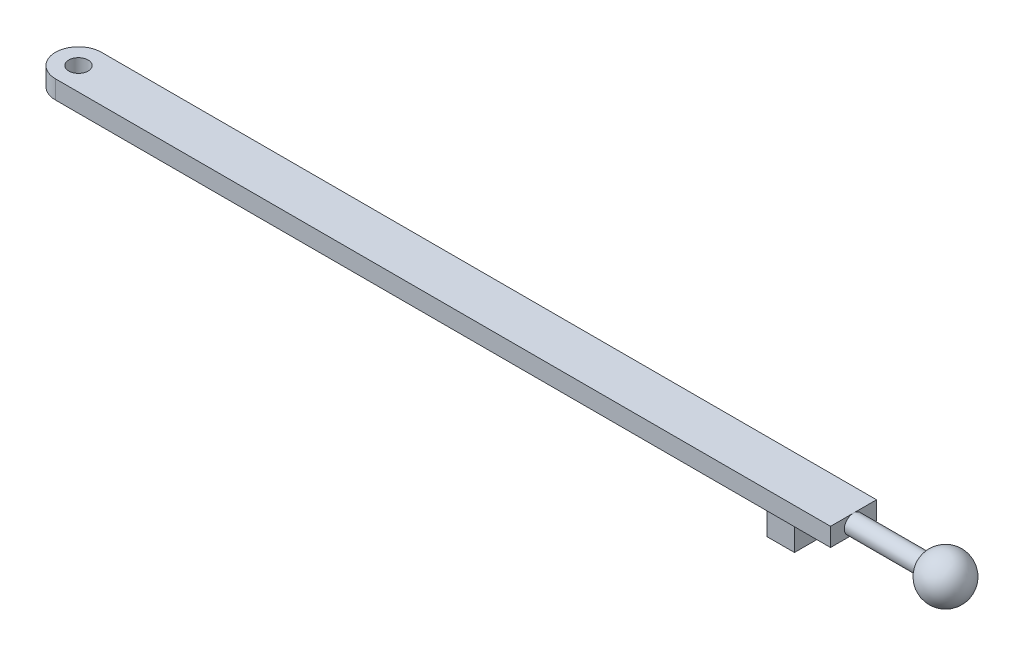
ISO-10303-21;
HEADER;
FILE_DESCRIPTION(('STEP AP214'),'2;1');
FILE_NAME('part.step','',(''),(''),'','','');
FILE_SCHEMA(('AUTOMOTIVE_DESIGN { 1 0 10303 214 1 1 1 1 }'));
ENDSEC;
DATA;
#1=APPLICATION_CONTEXT('core data for automotive mechanical design processes');
#2=APPLICATION_PROTOCOL_DEFINITION('international standard','automotive_design',2000,#1);
#3=PRODUCT_CONTEXT('',#1,'mechanical');
#4=PRODUCT('Part','Part','',(#3));
#5=PRODUCT_RELATED_PRODUCT_CATEGORY('part','',(#4));
#6=PRODUCT_DEFINITION_FORMATION('','',#4);
#7=PRODUCT_DEFINITION_CONTEXT('part definition',#1,'design');
#8=PRODUCT_DEFINITION('design','',#6,#7);
#9=PRODUCT_DEFINITION_SHAPE('','',#8);
#10=(LENGTH_UNIT() NAMED_UNIT(*) SI_UNIT(.MILLI.,.METRE.));
#11=(NAMED_UNIT(*) PLANE_ANGLE_UNIT() SI_UNIT($,.RADIAN.));
#12=(NAMED_UNIT(*) SI_UNIT($,.STERADIAN.) SOLID_ANGLE_UNIT());
#13=UNCERTAINTY_MEASURE_WITH_UNIT(LENGTH_MEASURE(1.E-05),#10,'distance_accuracy_value','');
#14=(GEOMETRIC_REPRESENTATION_CONTEXT(3) GLOBAL_UNCERTAINTY_ASSIGNED_CONTEXT((#13)) GLOBAL_UNIT_ASSIGNED_CONTEXT((#10,
#11,#12)) REPRESENTATION_CONTEXT('',''));
#15=CARTESIAN_POINT('',(0.,0.,0.));
#16=DIRECTION('',(0.,0.,1.));
#17=DIRECTION('',(1.,0.,0.));
#18=AXIS2_PLACEMENT_3D('',#15,#16,#17);
#19=CARTESIAN_POINT('',(11.,1.,0.));
#20=DIRECTION('',(-1.,0.,0.));
#21=DIRECTION('',(0.,0.,1.));
#22=AXIS2_PLACEMENT_3D('',#19,#20,#21);
#23=CYLINDRICAL_SURFACE('',#22,1.);
#24=CARTESIAN_POINT('',(0.,1.,0.));
#25=DIRECTION('',(1.,0.,0.));
#26=DIRECTION('',(0.,0.,-1.));
#27=AXIS2_PLACEMENT_3D('',#24,#25,#26);
#28=CIRCLE('',#27,1.);
#29=CARTESIAN_POINT('',(0.,2.,0.));
#30=VERTEX_POINT('',#29);
#31=CARTESIAN_POINT('',(0.,0.,0.));
#32=VERTEX_POINT('',#31);
#33=EDGE_CURVE('E166',#30,#32,#28,.T.);
#34=ORIENTED_EDGE('',*,*,#33,.T.);
#35=EDGE_CURVE('E49',#32,#30,#28,.T.);
#36=ORIENTED_EDGE('',*,*,#35,.T.);
#37=EDGE_LOOP('',(#34,#36));
#38=FACE_BOUND('',#37,.T.);
#39=CARTESIAN_POINT('',(7.70871215252208,1.,0.));
#40=DIRECTION('',(1.,0.,0.));
#41=DIRECTION('',(0.,0.,-1.));
#42=AXIS2_PLACEMENT_3D('',#39,#40,#41);
#43=CIRCLE('',#42,1.);
#44=CARTESIAN_POINT('',(7.70871215252208,1.,-1.));
#45=VERTEX_POINT('',#44);
#46=EDGE_CURVE('E11',#45,#45,#43,.T.);
#47=ORIENTED_EDGE('',*,*,#46,.F.);
#48=EDGE_LOOP('',(#47));
#49=FACE_BOUND('',#48,.T.);
#50=ADVANCED_FACE('F41',(#38,#49),#23,.T.);
#51=CARTESIAN_POINT('',(-10.,0.,0.));
#52=DIRECTION('',(0.,1.,0.));
#53=DIRECTION('',(0.,0.,1.));
#54=AXIS2_PLACEMENT_3D('',#51,#52,#53);
#55=PLANE('',#54);
#56=CARTESIAN_POINT('',(-84.29,0.,0.));
#57=DIRECTION('',(0.,1.,0.));
#58=DIRECTION('',(0.,0.,1.));
#59=AXIS2_PLACEMENT_3D('',#56,#57,#58);
#60=CIRCLE('',#59,1.04999999999999);
#61=CARTESIAN_POINT('',(-84.29,0.,1.04999999999999));
#62=VERTEX_POINT('',#61);
#63=EDGE_CURVE('E247',#62,#62,#60,.T.);
#64=ORIENTED_EDGE('',*,*,#63,.T.);
#65=EDGE_LOOP('',(#64));
#66=FACE_BOUND('',#65,.T.);
#67=DIRECTION('',(0.,0.,-1.));
#68=VECTOR('',#67,1.);
#69=CARTESIAN_POINT('',(-7.99731809148562,0.,0.470102011725863));
#70=LINE('',#69,#68);
#71=CARTESIAN_POINT('',(-7.99731809148562,0.,0.470102011725863));
#72=VERTEX_POINT('',#71);
#73=CARTESIAN_POINT('',(-7.99731809148562,0.,-0.261167784292134));
#74=VERTEX_POINT('',#73);
#75=EDGE_CURVE('E204',#72,#74,#70,.T.);
#76=ORIENTED_EDGE('',*,*,#75,.F.);
#77=DIRECTION('',(-1.,0.,0.));
#78=VECTOR('',#77,1.);
#79=CARTESIAN_POINT('',(-7.99731809148562,0.,0.470102011725863));
#80=LINE('',#79,#78);
#81=CARTESIAN_POINT('',(-7.44886574447212,0.,0.470102011725863));
#82=VERTEX_POINT('',#81);
#83=EDGE_CURVE('E198',#82,#72,#80,.T.);
#84=ORIENTED_EDGE('',*,*,#83,.F.);
#85=DIRECTION('',(0.,0.,1.));
#86=VECTOR('',#85,1.);
#87=CARTESIAN_POINT('',(-7.44886574447212,0.,0.470102011725863));
#88=LINE('',#87,#86);
#89=CARTESIAN_POINT('',(-7.44886574447212,0.,-0.261167784292134));
#90=VERTEX_POINT('',#89);
#91=EDGE_CURVE('E61',#90,#82,#88,.T.);
#92=ORIENTED_EDGE('',*,*,#91,.F.);
#93=DIRECTION('',(1.,0.,0.));
#94=VECTOR('',#93,1.);
#95=CARTESIAN_POINT('',(-7.99731809148562,0.,-0.261167784292134));
#96=LINE('',#95,#94);
#97=EDGE_CURVE('E56',#74,#90,#96,.T.);
#98=ORIENTED_EDGE('',*,*,#97,.F.);
#99=EDGE_LOOP('',(#76,#84,#92,#98));
#100=FACE_BOUND('',#99,.T.);
#101=DIRECTION('',(1.,0.,0.));
#102=VECTOR('',#101,1.);
#103=CARTESIAN_POINT('',(-10.,0.,2.5));
#104=LINE('',#103,#102);
#105=CARTESIAN_POINT('',(-84.29,0.,2.5));
#106=VERTEX_POINT('',#105);
#107=CARTESIAN_POINT('',(0.,0.,2.5));
#108=VERTEX_POINT('',#107);
#109=EDGE_CURVE('E171',#106,#108,#104,.T.);
#110=ORIENTED_EDGE('',*,*,#109,.F.);
#111=CARTESIAN_POINT('',(-84.29,0.,0.));
#112=DIRECTION('',(0.,-1.,0.));
#113=DIRECTION('',(0.,0.,-1.));
#114=AXIS2_PLACEMENT_3D('',#111,#112,#113);
#115=CIRCLE('',#114,2.5);
#116=CARTESIAN_POINT('',(-84.29,0.,-2.5));
#117=VERTEX_POINT('',#116);
#118=EDGE_CURVE('E144',#117,#106,#115,.F.);
#119=ORIENTED_EDGE('',*,*,#118,.F.);
#120=DIRECTION('',(-1.,0.,0.));
#121=VECTOR('',#120,1.);
#122=CARTESIAN_POINT('',(-10.,0.,-2.5));
#123=LINE('',#122,#121);
#124=CARTESIAN_POINT('',(0.,0.,-2.5));
#125=VERTEX_POINT('',#124);
#126=EDGE_CURVE('E158',#125,#117,#123,.T.);
#127=ORIENTED_EDGE('',*,*,#126,.F.);
#128=DIRECTION('',(0.,0.,-1.));
#129=VECTOR('',#128,1.);
#130=CARTESIAN_POINT('',(0.,0.,-2.5));
#131=LINE('',#130,#129);
#132=EDGE_CURVE('E173',#32,#125,#131,.T.);
#133=ORIENTED_EDGE('',*,*,#132,.F.);
#134=EDGE_CURVE('E163',#108,#32,#131,.T.);
#135=ORIENTED_EDGE('',*,*,#134,.F.);
#136=EDGE_LOOP('',(#110,#119,#127,#133,#135));
#137=FACE_BOUND('',#136,.T.);
#138=ADVANCED_FACE('F258',(#66,#100,#137),#55,.F.);
#139=CARTESIAN_POINT('',(-10.,2.,0.));
#140=DIRECTION('',(0.,1.,0.));
#141=DIRECTION('',(0.,0.,1.));
#142=AXIS2_PLACEMENT_3D('',#139,#140,#141);
#143=PLANE('',#142);
#144=CARTESIAN_POINT('',(-84.29,2.,0.));
#145=DIRECTION('',(0.,1.,0.));
#146=DIRECTION('',(0.,0.,1.));
#147=AXIS2_PLACEMENT_3D('',#144,#145,#146);
#148=CIRCLE('',#147,1.04999999999999);
#149=CARTESIAN_POINT('',(-84.29,2.,1.04999999999999));
#150=VERTEX_POINT('',#149);
#151=EDGE_CURVE('E152',#150,#150,#148,.T.);
#152=ORIENTED_EDGE('',*,*,#151,.F.);
#153=EDGE_LOOP('',(#152));
#154=FACE_BOUND('',#153,.T.);
#155=CARTESIAN_POINT('',(-84.29,2.,0.));
#156=DIRECTION('',(0.,-1.,0.));
#157=DIRECTION('',(0.,0.,-1.));
#158=AXIS2_PLACEMENT_3D('',#155,#156,#157);
#159=CIRCLE('',#158,2.5);
#160=CARTESIAN_POINT('',(-84.29,2.,-2.5));
#161=VERTEX_POINT('',#160);
#162=CARTESIAN_POINT('',(-84.29,2.,2.5));
#163=VERTEX_POINT('',#162);
#164=EDGE_CURVE('E133',#161,#163,#159,.F.);
#165=ORIENTED_EDGE('',*,*,#164,.T.);
#166=DIRECTION('',(1.,0.,0.));
#167=VECTOR('',#166,1.);
#168=CARTESIAN_POINT('',(-10.,2.,2.5));
#169=LINE('',#168,#167);
#170=CARTESIAN_POINT('',(0.,2.,2.5));
#171=VERTEX_POINT('',#170);
#172=EDGE_CURVE('E137',#163,#171,#169,.T.);
#173=ORIENTED_EDGE('',*,*,#172,.T.);
#174=DIRECTION('',(0.,0.,-1.));
#175=VECTOR('',#174,1.);
#176=CARTESIAN_POINT('',(0.,2.,-2.5));
#177=LINE('',#176,#175);
#178=EDGE_CURVE('E160',#171,#30,#177,.T.);
#179=ORIENTED_EDGE('',*,*,#178,.T.);
#180=CARTESIAN_POINT('',(0.,2.,-2.5));
#181=VERTEX_POINT('',#180);
#182=EDGE_CURVE('E157',#30,#181,#177,.T.);
#183=ORIENTED_EDGE('',*,*,#182,.T.);
#184=DIRECTION('',(-1.,0.,0.));
#185=VECTOR('',#184,1.);
#186=CARTESIAN_POINT('',(-10.,2.,-2.5));
#187=LINE('',#186,#185);
#188=EDGE_CURVE('E140',#181,#161,#187,.T.);
#189=ORIENTED_EDGE('',*,*,#188,.T.);
#190=EDGE_LOOP('',(#165,#173,#179,#183,#189));
#191=FACE_BOUND('',#190,.T.);
#192=ADVANCED_FACE('F135',(#154,#191),#143,.T.);
#193=CARTESIAN_POINT('',(-10.,2.,2.5));
#194=DIRECTION('',(0.,0.,-1.));
#195=DIRECTION('',(-1.,0.,0.));
#196=AXIS2_PLACEMENT_3D('',#193,#194,#195);
#197=PLANE('',#196);
#198=DIRECTION('',(0.,-1.,0.));
#199=VECTOR('',#198,1.);
#200=CARTESIAN_POINT('',(-84.29,2.,2.5));
#201=LINE('',#200,#199);
#202=EDGE_CURVE('E147',#163,#106,#201,.T.);
#203=ORIENTED_EDGE('',*,*,#202,.T.);
#204=ORIENTED_EDGE('',*,*,#109,.T.);
#205=DIRECTION('',(0.,-1.,0.));
#206=VECTOR('',#205,1.);
#207=CARTESIAN_POINT('',(0.,2.,2.5));
#208=LINE('',#207,#206);
#209=EDGE_CURVE('E155',#171,#108,#208,.T.);
#210=ORIENTED_EDGE('',*,*,#209,.F.);
#211=ORIENTED_EDGE('',*,*,#172,.F.);
#212=EDGE_LOOP('',(#203,#204,#210,#211));
#213=FACE_BOUND('',#212,.T.);
#214=ADVANCED_FACE('F43',(#213),#197,.F.);
#215=CARTESIAN_POINT('',(0.,2.,-2.5));
#216=DIRECTION('',(-1.,0.,0.));
#217=DIRECTION('',(0.,0.,1.));
#218=AXIS2_PLACEMENT_3D('',#215,#216,#217);
#219=PLANE('',#218);
#220=ORIENTED_EDGE('',*,*,#33,.F.);
#221=ORIENTED_EDGE('',*,*,#178,.F.);
#222=ORIENTED_EDGE('',*,*,#209,.T.);
#223=ORIENTED_EDGE('',*,*,#134,.T.);
#224=EDGE_LOOP('',(#220,#221,#222,#223));
#225=FACE_BOUND('',#224,.T.);
#226=ADVANCED_FACE('F264',(#225),#219,.F.);
#227=ORIENTED_EDGE('',*,*,#35,.F.);
#228=ORIENTED_EDGE('',*,*,#132,.T.);
#229=DIRECTION('',(0.,-1.,0.));
#230=VECTOR('',#229,1.);
#231=CARTESIAN_POINT('',(0.,2.,-2.5));
#232=LINE('',#231,#230);
#233=EDGE_CURVE('E170',#181,#125,#232,.T.);
#234=ORIENTED_EDGE('',*,*,#233,.F.);
#235=ORIENTED_EDGE('',*,*,#182,.F.);
#236=EDGE_LOOP('',(#227,#228,#234,#235));
#237=FACE_BOUND('',#236,.T.);
#238=ADVANCED_FACE('F380',(#237),#219,.F.);
#239=CARTESIAN_POINT('',(-10.,2.,-2.5));
#240=DIRECTION('',(0.,0.,1.));
#241=DIRECTION('',(1.,0.,0.));
#242=AXIS2_PLACEMENT_3D('',#239,#240,#241);
#243=PLANE('',#242);
#244=ORIENTED_EDGE('',*,*,#126,.T.);
#245=DIRECTION('',(0.,-1.,0.));
#246=VECTOR('',#245,1.);
#247=CARTESIAN_POINT('',(-84.29,2.,-2.5));
#248=LINE('',#247,#246);
#249=EDGE_CURVE('E143',#161,#117,#248,.T.);
#250=ORIENTED_EDGE('',*,*,#249,.F.);
#251=ORIENTED_EDGE('',*,*,#188,.F.);
#252=ORIENTED_EDGE('',*,*,#233,.T.);
#253=EDGE_LOOP('',(#244,#250,#251,#252));
#254=FACE_BOUND('',#253,.T.);
#255=ADVANCED_FACE('F277',(#254),#243,.F.);
#256=CARTESIAN_POINT('',(-7.99731809148562,-1.,0.470102011725863));
#257=DIRECTION('',(1.,0.,0.));
#258=DIRECTION('',(0.,0.,-1.));
#259=AXIS2_PLACEMENT_3D('',#256,#257,#258);
#260=PLANE('',#259);
#261=ORIENTED_EDGE('',*,*,#75,.T.);
#262=DIRECTION('',(0.,1.,0.));
#263=VECTOR('',#262,1.);
#264=CARTESIAN_POINT('',(-7.99731809148562,-1.,-0.261167784292134));
#265=LINE('',#264,#263);
#266=CARTESIAN_POINT('',(-7.99731809148562,-1.,-0.261167784292134));
#267=VERTEX_POINT('',#266);
#268=EDGE_CURVE('E182',#267,#74,#265,.T.);
#269=ORIENTED_EDGE('',*,*,#268,.F.);
#270=DIRECTION('',(0.,0.,-1.));
#271=VECTOR('',#270,1.);
#272=CARTESIAN_POINT('',(-7.99731809148562,-1.,0.470102011725863));
#273=LINE('',#272,#271);
#274=CARTESIAN_POINT('',(-7.99731809148562,-1.,0.470102011725863));
#275=VERTEX_POINT('',#274);
#276=EDGE_CURVE('E201',#275,#267,#273,.T.);
#277=ORIENTED_EDGE('',*,*,#276,.F.);
#278=DIRECTION('',(0.,1.,0.));
#279=VECTOR('',#278,1.);
#280=CARTESIAN_POINT('',(-7.99731809148562,-1.,0.470102011725863));
#281=LINE('',#280,#279);
#282=EDGE_CURVE('E194',#275,#72,#281,.T.);
#283=ORIENTED_EDGE('',*,*,#282,.T.);
#284=EDGE_LOOP('',(#261,#269,#277,#283));
#285=FACE_BOUND('',#284,.T.);
#286=ADVANCED_FACE('F273',(#285),#260,.F.);
#287=CARTESIAN_POINT('',(-7.99731809148562,-1.,-0.261167784292134));
#288=DIRECTION('',(0.,0.,1.));
#289=DIRECTION('',(1.,0.,0.));
#290=AXIS2_PLACEMENT_3D('',#287,#288,#289);
#291=PLANE('',#290);
#292=ORIENTED_EDGE('',*,*,#97,.T.);
#293=DIRECTION('',(0.,1.,0.));
#294=VECTOR('',#293,1.);
#295=CARTESIAN_POINT('',(-7.44886574447212,-1.,-0.261167784292134));
#296=LINE('',#295,#294);
#297=CARTESIAN_POINT('',(-7.44886574447212,-1.,-0.261167784292134));
#298=VERTEX_POINT('',#297);
#299=EDGE_CURVE('E184',#298,#90,#296,.T.);
#300=ORIENTED_EDGE('',*,*,#299,.F.);
#301=DIRECTION('',(1.,0.,0.));
#302=VECTOR('',#301,1.);
#303=CARTESIAN_POINT('',(-7.99731809148562,-1.,-0.261167784292134));
#304=LINE('',#303,#302);
#305=EDGE_CURVE('E212',#267,#298,#304,.T.);
#306=ORIENTED_EDGE('',*,*,#305,.F.);
#307=ORIENTED_EDGE('',*,*,#268,.T.);
#308=EDGE_LOOP('',(#292,#300,#306,#307));
#309=FACE_BOUND('',#308,.T.);
#310=ADVANCED_FACE('F276',(#309),#291,.F.);
#311=CARTESIAN_POINT('',(-7.44886574447212,-1.,0.470102011725863));
#312=DIRECTION('',(-1.,0.,0.));
#313=DIRECTION('',(0.,0.,1.));
#314=AXIS2_PLACEMENT_3D('',#311,#312,#313);
#315=PLANE('',#314);
#316=ORIENTED_EDGE('',*,*,#91,.T.);
#317=DIRECTION('',(0.,1.,0.));
#318=VECTOR('',#317,1.);
#319=CARTESIAN_POINT('',(-7.44886574447212,-1.,0.470102011725863));
#320=LINE('',#319,#318);
#321=CARTESIAN_POINT('',(-7.44886574447212,-1.,0.470102011725863));
#322=VERTEX_POINT('',#321);
#323=EDGE_CURVE('E189',#322,#82,#320,.T.);
#324=ORIENTED_EDGE('',*,*,#323,.F.);
#325=DIRECTION('',(0.,0.,1.));
#326=VECTOR('',#325,1.);
#327=CARTESIAN_POINT('',(-7.44886574447212,-1.,0.470102011725863));
#328=LINE('',#327,#326);
#329=EDGE_CURVE('E209',#298,#322,#328,.T.);
#330=ORIENTED_EDGE('',*,*,#329,.F.);
#331=ORIENTED_EDGE('',*,*,#299,.T.);
#332=EDGE_LOOP('',(#316,#324,#330,#331));
#333=FACE_BOUND('',#332,.T.);
#334=ADVANCED_FACE('F281',(#333),#315,.F.);
#335=CARTESIAN_POINT('',(-7.99731809148562,-1.,0.470102011725863));
#336=DIRECTION('',(0.,0.,-1.));
#337=DIRECTION('',(-1.,0.,0.));
#338=AXIS2_PLACEMENT_3D('',#335,#336,#337);
#339=PLANE('',#338);
#340=ORIENTED_EDGE('',*,*,#83,.T.);
#341=ORIENTED_EDGE('',*,*,#282,.F.);
#342=DIRECTION('',(-1.,0.,0.));
#343=VECTOR('',#342,1.);
#344=CARTESIAN_POINT('',(-7.99731809148562,-1.,0.470102011725863));
#345=LINE('',#344,#343);
#346=EDGE_CURVE('E197',#322,#275,#345,.T.);
#347=ORIENTED_EDGE('',*,*,#346,.F.);
#348=ORIENTED_EDGE('',*,*,#323,.T.);
#349=EDGE_LOOP('',(#340,#341,#347,#348));
#350=FACE_BOUND('',#349,.T.);
#351=ADVANCED_FACE('F284',(#350),#339,.F.);
#352=CARTESIAN_POINT('',(0.,-1.,0.));
#353=DIRECTION('',(0.,-1.,0.));
#354=DIRECTION('',(0.,0.,-1.));
#355=AXIS2_PLACEMENT_3D('',#352,#353,#354);
#356=PLANE('',#355);
#357=DIRECTION('',(0.,0.,-1.));
#358=VECTOR('',#357,1.);
#359=CARTESIAN_POINT('',(-8.47838569097579,-1.,0.931703098552411));
#360=LINE('',#359,#358);
#361=CARTESIAN_POINT('',(-8.47838569097579,-1.,0.931703098552411));
#362=VERTEX_POINT('',#361);
#363=CARTESIAN_POINT('',(-8.47838569097579,-1.,-1.86763503970475));
#364=VERTEX_POINT('',#363);
#365=EDGE_CURVE('E236',#362,#364,#360,.T.);
#366=ORIENTED_EDGE('',*,*,#365,.F.);
#367=DIRECTION('',(-1.,0.,0.));
#368=VECTOR('',#367,1.);
#369=CARTESIAN_POINT('',(-8.47838569097579,-1.,0.931703098552411));
#370=LINE('',#369,#368);
#371=CARTESIAN_POINT('',(-5.49242501016816,-1.,0.931703098552411));
#372=VERTEX_POINT('',#371);
#373=EDGE_CURVE('E229',#372,#362,#370,.T.);
#374=ORIENTED_EDGE('',*,*,#373,.F.);
#375=DIRECTION('',(0.,0.,1.));
#376=VECTOR('',#375,1.);
#377=CARTESIAN_POINT('',(-5.49242501016816,-1.,0.931703098552411));
#378=LINE('',#377,#376);
#379=CARTESIAN_POINT('',(-5.49242501016816,-1.,-1.86763503970475));
#380=VERTEX_POINT('',#379);
#381=EDGE_CURVE('E232',#380,#372,#378,.T.);
#382=ORIENTED_EDGE('',*,*,#381,.F.);
#383=DIRECTION('',(1.,0.,0.));
#384=VECTOR('',#383,1.);
#385=CARTESIAN_POINT('',(-8.47838569097579,-1.,-1.86763503970475));
#386=LINE('',#385,#384);
#387=EDGE_CURVE('E234',#364,#380,#386,.T.);
#388=ORIENTED_EDGE('',*,*,#387,.F.);
#389=EDGE_LOOP('',(#366,#374,#382,#388));
#390=FACE_BOUND('',#389,.T.);
#391=ORIENTED_EDGE('',*,*,#346,.T.);
#392=ORIENTED_EDGE('',*,*,#276,.T.);
#393=ORIENTED_EDGE('',*,*,#305,.T.);
#394=ORIENTED_EDGE('',*,*,#329,.T.);
#395=EDGE_LOOP('',(#391,#392,#393,#394));
#396=FACE_BOUND('',#395,.T.);
#397=ADVANCED_FACE('F288',(#390,#396),#356,.F.);
#398=CARTESIAN_POINT('',(-8.47838569097579,-4.,0.931703098552411));
#399=DIRECTION('',(1.,0.,0.));
#400=DIRECTION('',(0.,0.,-1.));
#401=AXIS2_PLACEMENT_3D('',#398,#399,#400);
#402=PLANE('',#401);
#403=ORIENTED_EDGE('',*,*,#365,.T.);
#404=DIRECTION('',(0.,1.,0.));
#405=VECTOR('',#404,1.);
#406=CARTESIAN_POINT('',(-8.47838569097579,-4.,-1.86763503970475));
#407=LINE('',#406,#405);
#408=CARTESIAN_POINT('',(-8.47838569097579,-4.,-1.86763503970475));
#409=VERTEX_POINT('',#408);
#410=EDGE_CURVE('E206',#409,#364,#407,.T.);
#411=ORIENTED_EDGE('',*,*,#410,.F.);
#412=DIRECTION('',(0.,0.,-1.));
#413=VECTOR('',#412,1.);
#414=CARTESIAN_POINT('',(-8.47838569097579,-4.,0.931703098552411));
#415=LINE('',#414,#413);
#416=CARTESIAN_POINT('',(-8.47838569097579,-4.,0.931703098552411));
#417=VERTEX_POINT('',#416);
#418=EDGE_CURVE('E231',#417,#409,#415,.T.);
#419=ORIENTED_EDGE('',*,*,#418,.F.);
#420=DIRECTION('',(0.,1.,0.));
#421=VECTOR('',#420,1.);
#422=CARTESIAN_POINT('',(-8.47838569097579,-4.,0.931703098552411));
#423=LINE('',#422,#421);
#424=EDGE_CURVE('E225',#417,#362,#423,.T.);
#425=ORIENTED_EDGE('',*,*,#424,.T.);
#426=EDGE_LOOP('',(#403,#411,#419,#425));
#427=FACE_BOUND('',#426,.T.);
#428=ADVANCED_FACE('F290',(#427),#402,.F.);
#429=CARTESIAN_POINT('',(-8.47838569097579,-4.,-1.86763503970475));
#430=DIRECTION('',(0.,0.,1.));
#431=DIRECTION('',(1.,0.,0.));
#432=AXIS2_PLACEMENT_3D('',#429,#430,#431);
#433=PLANE('',#432);
#434=ORIENTED_EDGE('',*,*,#387,.T.);
#435=DIRECTION('',(0.,1.,0.));
#436=VECTOR('',#435,1.);
#437=CARTESIAN_POINT('',(-5.49242501016816,-4.,-1.86763503970475));
#438=LINE('',#437,#436);
#439=CARTESIAN_POINT('',(-5.49242501016816,-4.,-1.86763503970475));
#440=VERTEX_POINT('',#439);
#441=EDGE_CURVE('E219',#440,#380,#438,.T.);
#442=ORIENTED_EDGE('',*,*,#441,.F.);
#443=DIRECTION('',(1.,0.,0.));
#444=VECTOR('',#443,1.);
#445=CARTESIAN_POINT('',(-8.47838569097579,-4.,-1.86763503970475));
#446=LINE('',#445,#444);
#447=EDGE_CURVE('E242',#409,#440,#446,.T.);
#448=ORIENTED_EDGE('',*,*,#447,.F.);
#449=ORIENTED_EDGE('',*,*,#410,.T.);
#450=EDGE_LOOP('',(#434,#442,#448,#449));
#451=FACE_BOUND('',#450,.T.);
#452=ADVANCED_FACE('F293',(#451),#433,.F.);
#453=CARTESIAN_POINT('',(-5.49242501016816,-4.,0.931703098552411));
#454=DIRECTION('',(-1.,0.,0.));
#455=DIRECTION('',(0.,0.,1.));
#456=AXIS2_PLACEMENT_3D('',#453,#454,#455);
#457=PLANE('',#456);
#458=ORIENTED_EDGE('',*,*,#381,.T.);
#459=DIRECTION('',(0.,1.,0.));
#460=VECTOR('',#459,1.);
#461=CARTESIAN_POINT('',(-5.49242501016816,-4.,0.931703098552411));
#462=LINE('',#461,#460);
#463=CARTESIAN_POINT('',(-5.49242501016816,-4.,0.931703098552411));
#464=VERTEX_POINT('',#463);
#465=EDGE_CURVE('E222',#464,#372,#462,.T.);
#466=ORIENTED_EDGE('',*,*,#465,.F.);
#467=DIRECTION('',(0.,0.,1.));
#468=VECTOR('',#467,1.);
#469=CARTESIAN_POINT('',(-5.49242501016816,-4.,0.931703098552411));
#470=LINE('',#469,#468);
#471=EDGE_CURVE('E240',#440,#464,#470,.T.);
#472=ORIENTED_EDGE('',*,*,#471,.F.);
#473=ORIENTED_EDGE('',*,*,#441,.T.);
#474=EDGE_LOOP('',(#458,#466,#472,#473));
#475=FACE_BOUND('',#474,.T.);
#476=ADVANCED_FACE('F297',(#475),#457,.F.);
#477=CARTESIAN_POINT('',(-8.47838569097579,-4.,0.931703098552411));
#478=DIRECTION('',(0.,0.,-1.));
#479=DIRECTION('',(-1.,0.,0.));
#480=AXIS2_PLACEMENT_3D('',#477,#478,#479);
#481=PLANE('',#480);
#482=ORIENTED_EDGE('',*,*,#373,.T.);
#483=ORIENTED_EDGE('',*,*,#424,.F.);
#484=DIRECTION('',(-1.,0.,0.));
#485=VECTOR('',#484,1.);
#486=CARTESIAN_POINT('',(-8.47838569097579,-4.,0.931703098552411));
#487=LINE('',#486,#485);
#488=EDGE_CURVE('E228',#464,#417,#487,.T.);
#489=ORIENTED_EDGE('',*,*,#488,.F.);
#490=ORIENTED_EDGE('',*,*,#465,.T.);
#491=EDGE_LOOP('',(#482,#483,#489,#490));
#492=FACE_BOUND('',#491,.T.);
#493=ADVANCED_FACE('F301',(#492),#481,.F.);
#494=CARTESIAN_POINT('',(0.,-4.,0.));
#495=DIRECTION('',(0.,-1.,0.));
#496=DIRECTION('',(0.,0.,-1.));
#497=AXIS2_PLACEMENT_3D('',#494,#495,#496);
#498=PLANE('',#497);
#499=ORIENTED_EDGE('',*,*,#418,.T.);
#500=ORIENTED_EDGE('',*,*,#447,.T.);
#501=ORIENTED_EDGE('',*,*,#471,.T.);
#502=ORIENTED_EDGE('',*,*,#488,.T.);
#503=EDGE_LOOP('',(#499,#500,#501,#502));
#504=FACE_BOUND('',#503,.T.);
#505=ADVANCED_FACE('F305',(#504),#498,.T.);
#506=CARTESIAN_POINT('',(-84.29,2.,0.));
#507=DIRECTION('',(0.,-1.,0.));
#508=DIRECTION('',(0.,0.,-1.));
#509=AXIS2_PLACEMENT_3D('',#506,#507,#508);
#510=CYLINDRICAL_SURFACE('',#509,2.5);
#511=ORIENTED_EDGE('',*,*,#118,.T.);
#512=ORIENTED_EDGE('',*,*,#202,.F.);
#513=ORIENTED_EDGE('',*,*,#164,.F.);
#514=ORIENTED_EDGE('',*,*,#249,.T.);
#515=EDGE_LOOP('',(#511,#512,#513,#514));
#516=FACE_BOUND('',#515,.T.);
#517=ADVANCED_FACE('F148',(#516),#510,.T.);
#518=CARTESIAN_POINT('',(-84.29,-4.,0.));
#519=DIRECTION('',(0.,1.,0.));
#520=DIRECTION('',(0.,0.,1.));
#521=AXIS2_PLACEMENT_3D('',#518,#519,#520);
#522=CYLINDRICAL_SURFACE('',#521,1.04999999999999);
#523=ORIENTED_EDGE('',*,*,#151,.T.);
#524=EDGE_LOOP('',(#523));
#525=FACE_BOUND('',#524,.T.);
#526=ORIENTED_EDGE('',*,*,#63,.F.);
#527=EDGE_LOOP('',(#526));
#528=FACE_BOUND('',#527,.T.);
#529=ADVANCED_FACE('F254',(#525,#528),#522,.F.);
#530=CARTESIAN_POINT('',(10.,1.,0.));
#531=DIRECTION('',(1.,0.,0.));
#532=DIRECTION('',(0.,0.,-1.));
#533=AXIS2_PLACEMENT_3D('',#530,#531,#532);
#534=SPHERICAL_SURFACE('',#533,2.5);
#535=ORIENTED_EDGE('',*,*,#46,.T.);
#536=EDGE_LOOP('',(#535));
#537=FACE_BOUND('',#536,.T.);
#538=ADVANCED_FACE('F317',(#537),#534,.T.);
#539=CLOSED_SHELL('',(#50,#138,#192,#214,#226,#238,#255,#286,#310,#334,#351,#397,#428,#452,#476,
#493,#505,#517,#529,#538));
#540=MANIFOLD_SOLID_BREP('B2',#539);
#541=ADVANCED_BREP_SHAPE_REPRESENTATION('',(#18,#540),#14);
#542=SHAPE_DEFINITION_REPRESENTATION(#9,#541);
ENDSEC;
END-ISO-10303-21;
